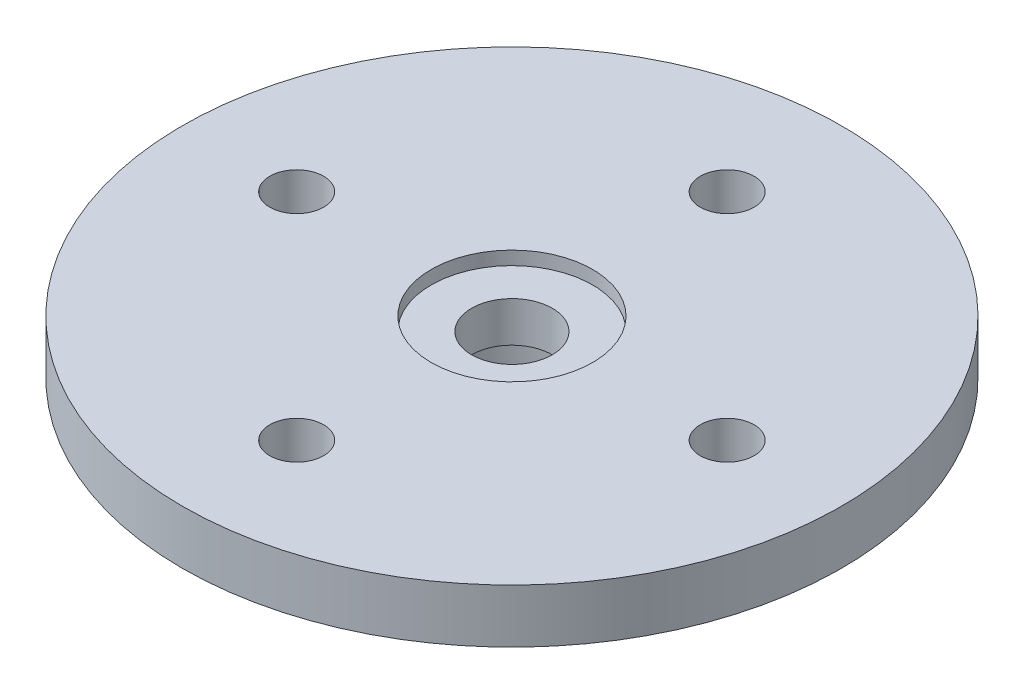
ISO-10303-21;
HEADER;
FILE_DESCRIPTION(('STEP AP214'),'2;1');
FILE_NAME('part.step','',(''),(''),'','','');
FILE_SCHEMA(('AUTOMOTIVE_DESIGN { 1 0 10303 214 1 1 1 1 }'));
ENDSEC;
DATA;
#1=APPLICATION_CONTEXT('core data for automotive mechanical design processes');
#2=APPLICATION_PROTOCOL_DEFINITION('international standard','automotive_design',2000,#1);
#3=PRODUCT_CONTEXT('',#1,'mechanical');
#4=PRODUCT('Part','Part','',(#3));
#5=PRODUCT_RELATED_PRODUCT_CATEGORY('part','',(#4));
#6=PRODUCT_DEFINITION_FORMATION('','',#4);
#7=PRODUCT_DEFINITION_CONTEXT('part definition',#1,'design');
#8=PRODUCT_DEFINITION('design','',#6,#7);
#9=PRODUCT_DEFINITION_SHAPE('','',#8);
#10=(LENGTH_UNIT() NAMED_UNIT(*) SI_UNIT(.MILLI.,.METRE.));
#11=(NAMED_UNIT(*) PLANE_ANGLE_UNIT() SI_UNIT($,.RADIAN.));
#12=(NAMED_UNIT(*) SI_UNIT($,.STERADIAN.) SOLID_ANGLE_UNIT());
#13=UNCERTAINTY_MEASURE_WITH_UNIT(LENGTH_MEASURE(1.E-05),#10,'distance_accuracy_value','');
#14=(GEOMETRIC_REPRESENTATION_CONTEXT(3) GLOBAL_UNCERTAINTY_ASSIGNED_CONTEXT((#13)) GLOBAL_UNIT_ASSIGNED_CONTEXT((#10,
#11,#12)) REPRESENTATION_CONTEXT('',''));
#15=CARTESIAN_POINT('',(0.,0.,0.));
#16=DIRECTION('',(0.,0.,1.));
#17=DIRECTION('',(1.,0.,0.));
#18=AXIS2_PLACEMENT_3D('',#15,#16,#17);
#19=CARTESIAN_POINT('',(0.,2.,0.));
#20=DIRECTION('',(0.,-1.,0.));
#21=DIRECTION('',(0.,0.,-1.));
#22=AXIS2_PLACEMENT_3D('',#19,#20,#21);
#23=CYLINDRICAL_SURFACE('',#22,1.5);
#24=CARTESIAN_POINT('',(0.,0.,0.));
#25=DIRECTION('',(0.,1.,0.));
#26=DIRECTION('',(0.,0.,1.));
#27=AXIS2_PLACEMENT_3D('',#24,#25,#26);
#28=CIRCLE('',#27,1.5);
#29=CARTESIAN_POINT('',(0.,0.,1.5));
#30=VERTEX_POINT('',#29);
#31=EDGE_CURVE('E52',#30,#30,#28,.T.);
#32=ORIENTED_EDGE('',*,*,#31,.F.);
#33=EDGE_LOOP('',(#32));
#34=FACE_BOUND('',#33,.T.);
#35=CARTESIAN_POINT('',(0.,1.5,0.));
#36=DIRECTION('',(0.,1.,0.));
#37=DIRECTION('',(0.,0.,1.));
#38=AXIS2_PLACEMENT_3D('',#35,#36,#37);
#39=CIRCLE('',#38,1.5);
#40=CARTESIAN_POINT('',(0.,1.5,1.5));
#41=VERTEX_POINT('',#40);
#42=EDGE_CURVE('E41',#41,#41,#39,.T.);
#43=ORIENTED_EDGE('',*,*,#42,.T.);
#44=EDGE_LOOP('',(#43));
#45=FACE_BOUND('',#44,.T.);
#46=ADVANCED_FACE('F37',(#34,#45),#23,.F.);
#47=CARTESIAN_POINT('',(0.,0.,0.));
#48=DIRECTION('',(0.,1.,0.));
#49=DIRECTION('',(0.,0.,1.));
#50=AXIS2_PLACEMENT_3D('',#47,#48,#49);
#51=PLANE('',#50);
#52=ORIENTED_EDGE('',*,*,#31,.T.);
#53=EDGE_LOOP('',(#52));
#54=FACE_BOUND('',#53,.T.);
#55=CARTESIAN_POINT('',(0.,0.,0.));
#56=DIRECTION('',(0.,-1.,0.));
#57=DIRECTION('',(0.,0.,-1.));
#58=AXIS2_PLACEMENT_3D('',#55,#56,#57);
#59=CIRCLE('',#58,2.9);
#60=CARTESIAN_POINT('',(0.,0.,-2.9));
#61=VERTEX_POINT('',#60);
#62=EDGE_CURVE('E85',#61,#61,#59,.T.);
#63=ORIENTED_EDGE('',*,*,#62,.T.);
#64=EDGE_LOOP('',(#63));
#65=FACE_BOUND('',#64,.T.);
#66=ADVANCED_FACE('F112',(#54,#65),#51,.F.);
#67=CARTESIAN_POINT('',(0.,2.,0.));
#68=DIRECTION('',(0.,-1.,0.));
#69=DIRECTION('',(0.,0.,-1.));
#70=AXIS2_PLACEMENT_3D('',#67,#68,#69);
#71=CYLINDRICAL_SURFACE('',#70,12.25);
#72=CARTESIAN_POINT('',(0.,2.,0.));
#73=DIRECTION('',(0.,1.,0.));
#74=DIRECTION('',(0.,0.,1.));
#75=AXIS2_PLACEMENT_3D('',#72,#73,#74);
#76=CIRCLE('',#75,12.25);
#77=CARTESIAN_POINT('',(0.,2.,12.25));
#78=VERTEX_POINT('',#77);
#79=EDGE_CURVE('E45',#78,#78,#76,.T.);
#80=ORIENTED_EDGE('',*,*,#79,.F.);
#81=EDGE_LOOP('',(#80));
#82=FACE_BOUND('',#81,.T.);
#83=CARTESIAN_POINT('',(0.,0.,0.));
#84=DIRECTION('',(0.,1.,0.));
#85=DIRECTION('',(0.,0.,1.));
#86=AXIS2_PLACEMENT_3D('',#83,#84,#85);
#87=CIRCLE('',#86,12.25);
#88=CARTESIAN_POINT('',(0.,0.,12.25));
#89=VERTEX_POINT('',#88);
#90=EDGE_CURVE('E56',#89,#89,#87,.T.);
#91=ORIENTED_EDGE('',*,*,#90,.T.);
#92=EDGE_LOOP('',(#91));
#93=FACE_BOUND('',#92,.T.);
#94=ADVANCED_FACE('F118',(#82,#93),#71,.T.);
#95=CARTESIAN_POINT('',(0.,2.,-8.));
#96=DIRECTION('',(0.,-1.,0.));
#97=DIRECTION('',(0.,0.,-1.));
#98=AXIS2_PLACEMENT_3D('',#95,#96,#97);
#99=CYLINDRICAL_SURFACE('',#98,1.);
#100=CARTESIAN_POINT('',(0.,2.,-8.));
#101=DIRECTION('',(0.,1.,0.));
#102=DIRECTION('',(0.,0.,1.));
#103=AXIS2_PLACEMENT_3D('',#100,#101,#102);
#104=CIRCLE('',#103,1.);
#105=CARTESIAN_POINT('',(0.,2.,-7.));
#106=VERTEX_POINT('',#105);
#107=EDGE_CURVE('E49',#106,#106,#104,.T.);
#108=ORIENTED_EDGE('',*,*,#107,.T.);
#109=EDGE_LOOP('',(#108));
#110=FACE_BOUND('',#109,.T.);
#111=CARTESIAN_POINT('',(0.,0.,-8.));
#112=DIRECTION('',(0.,1.,0.));
#113=DIRECTION('',(0.,0.,1.));
#114=AXIS2_PLACEMENT_3D('',#111,#112,#113);
#115=CIRCLE('',#114,1.);
#116=CARTESIAN_POINT('',(0.,0.,-7.));
#117=VERTEX_POINT('',#116);
#118=EDGE_CURVE('E59',#117,#117,#115,.T.);
#119=ORIENTED_EDGE('',*,*,#118,.F.);
#120=EDGE_LOOP('',(#119));
#121=FACE_BOUND('',#120,.T.);
#122=ADVANCED_FACE('F127',(#110,#121),#99,.F.);
#123=CARTESIAN_POINT('',(8.00000000000023,2.,-2.26393958003914E-13));
#124=DIRECTION('',(0.,-1.,0.));
#125=DIRECTION('',(0.,0.,-1.));
#126=AXIS2_PLACEMENT_3D('',#123,#124,#125);
#127=CYLINDRICAL_SURFACE('',#126,1.00000000000018);
#128=CARTESIAN_POINT('',(8.00000000000023,2.,-2.26393958003914E-13));
#129=DIRECTION('',(0.,1.,0.));
#130=DIRECTION('',(0.,0.,1.));
#131=AXIS2_PLACEMENT_3D('',#128,#129,#130);
#132=CIRCLE('',#131,1.00000000000018);
#133=CARTESIAN_POINT('',(8.00000000000023,2.,0.999999999999951));
#134=VERTEX_POINT('',#133);
#135=EDGE_CURVE('E74',#134,#134,#132,.T.);
#136=ORIENTED_EDGE('',*,*,#135,.T.);
#137=EDGE_LOOP('',(#136));
#138=FACE_BOUND('',#137,.T.);
#139=CARTESIAN_POINT('',(8.00000000000023,0.,-2.26393958003914E-13));
#140=DIRECTION('',(0.,1.,0.));
#141=DIRECTION('',(0.,0.,1.));
#142=AXIS2_PLACEMENT_3D('',#139,#140,#141);
#143=CIRCLE('',#142,1.00000000000018);
#144=CARTESIAN_POINT('',(8.00000000000023,0.,0.999999999999951));
#145=VERTEX_POINT('',#144);
#146=EDGE_CURVE('E62',#145,#145,#143,.T.);
#147=ORIENTED_EDGE('',*,*,#146,.F.);
#148=EDGE_LOOP('',(#147));
#149=FACE_BOUND('',#148,.T.);
#150=ADVANCED_FACE('F131',(#138,#149),#127,.F.);
#151=CARTESIAN_POINT('',(4.52787916007828E-13,2.,8.));
#152=DIRECTION('',(0.,-1.,0.));
#153=DIRECTION('',(0.,0.,-1.));
#154=AXIS2_PLACEMENT_3D('',#151,#152,#153);
#155=CYLINDRICAL_SURFACE('',#154,1.00000000000049);
#156=CARTESIAN_POINT('',(4.52787916007828E-13,2.,8.));
#157=DIRECTION('',(0.,1.,0.));
#158=DIRECTION('',(0.,0.,1.));
#159=AXIS2_PLACEMENT_3D('',#156,#157,#158);
#160=CIRCLE('',#159,1.00000000000049);
#161=CARTESIAN_POINT('',(4.52787916007828E-13,2.,9.00000000000049));
#162=VERTEX_POINT('',#161);
#163=EDGE_CURVE('E77',#162,#162,#160,.T.);
#164=ORIENTED_EDGE('',*,*,#163,.T.);
#165=EDGE_LOOP('',(#164));
#166=FACE_BOUND('',#165,.T.);
#167=CARTESIAN_POINT('',(4.52787916007828E-13,0.,8.));
#168=DIRECTION('',(0.,1.,0.));
#169=DIRECTION('',(0.,0.,1.));
#170=AXIS2_PLACEMENT_3D('',#167,#168,#169);
#171=CIRCLE('',#170,1.00000000000049);
#172=CARTESIAN_POINT('',(4.52787916007828E-13,0.,9.00000000000049));
#173=VERTEX_POINT('',#172);
#174=EDGE_CURVE('E65',#173,#173,#171,.T.);
#175=ORIENTED_EDGE('',*,*,#174,.F.);
#176=EDGE_LOOP('',(#175));
#177=FACE_BOUND('',#176,.T.);
#178=ADVANCED_FACE('F134',(#166,#177),#155,.F.);
#179=CARTESIAN_POINT('',(-7.99999999999977,2.,2.27373675443232E-13));
#180=DIRECTION('',(0.,-1.,0.));
#181=DIRECTION('',(0.,0.,-1.));
#182=AXIS2_PLACEMENT_3D('',#179,#180,#181);
#183=CYLINDRICAL_SURFACE('',#182,1.00000000000036);
#184=CARTESIAN_POINT('',(-7.99999999999977,2.,2.27373675443232E-13));
#185=DIRECTION('',(0.,1.,0.));
#186=DIRECTION('',(0.,0.,1.));
#187=AXIS2_PLACEMENT_3D('',#184,#185,#186);
#188=CIRCLE('',#187,1.00000000000036);
#189=CARTESIAN_POINT('',(-7.99999999999977,2.,1.00000000000059));
#190=VERTEX_POINT('',#189);
#191=EDGE_CURVE('E55',#190,#190,#188,.T.);
#192=ORIENTED_EDGE('',*,*,#191,.T.);
#193=EDGE_LOOP('',(#192));
#194=FACE_BOUND('',#193,.T.);
#195=CARTESIAN_POINT('',(-7.99999999999977,0.,2.27373675443232E-13));
#196=DIRECTION('',(0.,1.,0.));
#197=DIRECTION('',(0.,0.,1.));
#198=AXIS2_PLACEMENT_3D('',#195,#196,#197);
#199=CIRCLE('',#198,1.00000000000036);
#200=CARTESIAN_POINT('',(-7.99999999999977,0.,1.00000000000059));
#201=VERTEX_POINT('',#200);
#202=EDGE_CURVE('E68',#201,#201,#199,.T.);
#203=ORIENTED_EDGE('',*,*,#202,.F.);
#204=EDGE_LOOP('',(#203));
#205=FACE_BOUND('',#204,.T.);
#206=ADVANCED_FACE('F39',(#194,#205),#183,.F.);
#207=CARTESIAN_POINT('',(0.,2.,0.));
#208=DIRECTION('',(0.,1.,0.));
#209=DIRECTION('',(0.,0.,1.));
#210=AXIS2_PLACEMENT_3D('',#207,#208,#209);
#211=PLANE('',#210);
#212=CARTESIAN_POINT('',(0.,2.,0.));
#213=DIRECTION('',(0.,1.,0.));
#214=DIRECTION('',(0.,0.,1.));
#215=AXIS2_PLACEMENT_3D('',#212,#213,#214);
#216=CIRCLE('',#215,3.);
#217=CARTESIAN_POINT('',(0.,2.,3.));
#218=VERTEX_POINT('',#217);
#219=EDGE_CURVE('E90',#218,#218,#216,.T.);
#220=ORIENTED_EDGE('',*,*,#219,.F.);
#221=EDGE_LOOP('',(#220));
#222=FACE_BOUND('',#221,.T.);
#223=ORIENTED_EDGE('',*,*,#191,.F.);
#224=EDGE_LOOP('',(#223));
#225=FACE_BOUND('',#224,.T.);
#226=ORIENTED_EDGE('',*,*,#163,.F.);
#227=EDGE_LOOP('',(#226));
#228=FACE_BOUND('',#227,.T.);
#229=ORIENTED_EDGE('',*,*,#135,.F.);
#230=EDGE_LOOP('',(#229));
#231=FACE_BOUND('',#230,.T.);
#232=ORIENTED_EDGE('',*,*,#107,.F.);
#233=EDGE_LOOP('',(#232));
#234=FACE_BOUND('',#233,.T.);
#235=ORIENTED_EDGE('',*,*,#79,.T.);
#236=EDGE_LOOP('',(#235));
#237=FACE_BOUND('',#236,.T.);
#238=ADVANCED_FACE('F141',(#222,#225,#228,#231,#234,#237),#211,.T.);
#239=CARTESIAN_POINT('',(0.,0.,0.));
#240=DIRECTION('',(0.,1.,0.));
#241=DIRECTION('',(0.,0.,1.));
#242=AXIS2_PLACEMENT_3D('',#239,#240,#241);
#243=CIRCLE('',#242,4.9);
#244=CARTESIAN_POINT('',(0.,0.,4.9));
#245=VERTEX_POINT('',#244);
#246=EDGE_CURVE('E10',#245,#245,#243,.F.);
#247=ORIENTED_EDGE('',*,*,#246,.F.);
#248=EDGE_LOOP('',(#247));
#249=FACE_BOUND('',#248,.T.);
#250=ORIENTED_EDGE('',*,*,#202,.T.);
#251=EDGE_LOOP('',(#250));
#252=FACE_BOUND('',#251,.T.);
#253=ORIENTED_EDGE('',*,*,#174,.T.);
#254=EDGE_LOOP('',(#253));
#255=FACE_BOUND('',#254,.T.);
#256=ORIENTED_EDGE('',*,*,#146,.T.);
#257=EDGE_LOOP('',(#256));
#258=FACE_BOUND('',#257,.T.);
#259=ORIENTED_EDGE('',*,*,#118,.T.);
#260=EDGE_LOOP('',(#259));
#261=FACE_BOUND('',#260,.T.);
#262=ORIENTED_EDGE('',*,*,#90,.F.);
#263=EDGE_LOOP('',(#262));
#264=FACE_BOUND('',#263,.T.);
#265=ADVANCED_FACE('F121',(#249,#252,#255,#258,#261,#264),#51,.F.);
#266=CARTESIAN_POINT('',(0.,-3.,0.));
#267=DIRECTION('',(0.,-1.,0.));
#268=DIRECTION('',(0.,0.,-1.));
#269=AXIS2_PLACEMENT_3D('',#266,#267,#268);
#270=PLANE('',#269);
#271=CARTESIAN_POINT('',(0.,-3.,0.));
#272=DIRECTION('',(0.,-1.,0.));
#273=DIRECTION('',(0.,0.,-1.));
#274=AXIS2_PLACEMENT_3D('',#271,#272,#273);
#275=CIRCLE('',#274,4.9);
#276=CARTESIAN_POINT('',(0.,-3.,-4.9));
#277=VERTEX_POINT('',#276);
#278=EDGE_CURVE('E70',#277,#277,#275,.T.);
#279=ORIENTED_EDGE('',*,*,#278,.T.);
#280=EDGE_LOOP('',(#279));
#281=FACE_BOUND('',#280,.T.);
#282=CARTESIAN_POINT('',(0.,-3.,0.));
#283=DIRECTION('',(0.,-1.,0.));
#284=DIRECTION('',(0.,0.,-1.));
#285=AXIS2_PLACEMENT_3D('',#282,#283,#284);
#286=CIRCLE('',#285,2.9);
#287=CARTESIAN_POINT('',(0.,-3.,-2.9));
#288=VERTEX_POINT('',#287);
#289=EDGE_CURVE('E84',#288,#288,#286,.T.);
#290=ORIENTED_EDGE('',*,*,#289,.F.);
#291=EDGE_LOOP('',(#290));
#292=FACE_BOUND('',#291,.T.);
#293=ADVANCED_FACE('F149',(#281,#292),#270,.T.);
#294=CARTESIAN_POINT('',(0.,-3.,0.));
#295=DIRECTION('',(0.,1.,0.));
#296=DIRECTION('',(0.,0.,1.));
#297=AXIS2_PLACEMENT_3D('',#294,#295,#296);
#298=CYLINDRICAL_SURFACE('',#297,4.9);
#299=ORIENTED_EDGE('',*,*,#278,.F.);
#300=EDGE_LOOP('',(#299));
#301=FACE_BOUND('',#300,.T.);
#302=ORIENTED_EDGE('',*,*,#246,.T.);
#303=EDGE_LOOP('',(#302));
#304=FACE_BOUND('',#303,.T.);
#305=ADVANCED_FACE('F163',(#301,#304),#298,.T.);
#306=CARTESIAN_POINT('',(0.,-3.,0.));
#307=DIRECTION('',(0.,1.,0.));
#308=DIRECTION('',(0.,0.,1.));
#309=AXIS2_PLACEMENT_3D('',#306,#307,#308);
#310=CYLINDRICAL_SURFACE('',#309,2.9);
#311=ORIENTED_EDGE('',*,*,#289,.T.);
#312=EDGE_LOOP('',(#311));
#313=FACE_BOUND('',#312,.T.);
#314=ORIENTED_EDGE('',*,*,#62,.F.);
#315=EDGE_LOOP('',(#314));
#316=FACE_BOUND('',#315,.T.);
#317=ADVANCED_FACE('F108',(#313,#316),#310,.F.);
#318=CARTESIAN_POINT('',(0.,1.5,0.));
#319=DIRECTION('',(0.,1.,0.));
#320=DIRECTION('',(0.,0.,1.));
#321=AXIS2_PLACEMENT_3D('',#318,#319,#320);
#322=CYLINDRICAL_SURFACE('',#321,3.);
#323=CARTESIAN_POINT('',(0.,1.5,0.));
#324=DIRECTION('',(0.,1.,0.));
#325=DIRECTION('',(0.,0.,1.));
#326=AXIS2_PLACEMENT_3D('',#323,#324,#325);
#327=CIRCLE('',#326,3.);
#328=CARTESIAN_POINT('',(0.,1.5,3.));
#329=VERTEX_POINT('',#328);
#330=EDGE_CURVE('E93',#329,#329,#327,.T.);
#331=ORIENTED_EDGE('',*,*,#330,.F.);
#332=EDGE_LOOP('',(#331));
#333=FACE_BOUND('',#332,.T.);
#334=ORIENTED_EDGE('',*,*,#219,.T.);
#335=EDGE_LOOP('',(#334));
#336=FACE_BOUND('',#335,.T.);
#337=ADVANCED_FACE('F103',(#333,#336),#322,.F.);
#338=CARTESIAN_POINT('',(0.,1.5,0.));
#339=DIRECTION('',(0.,1.,0.));
#340=DIRECTION('',(0.,0.,1.));
#341=AXIS2_PLACEMENT_3D('',#338,#339,#340);
#342=PLANE('',#341);
#343=ORIENTED_EDGE('',*,*,#42,.F.);
#344=EDGE_LOOP('',(#343));
#345=FACE_BOUND('',#344,.T.);
#346=ORIENTED_EDGE('',*,*,#330,.T.);
#347=EDGE_LOOP('',(#346));
#348=FACE_BOUND('',#347,.T.);
#349=ADVANCED_FACE('F101',(#345,#348),#342,.T.);
#350=CLOSED_SHELL('',(#46,#66,#94,#122,#150,#178,#206,#238,#265,#293,#305,#317,#337,#349));
#351=MANIFOLD_SOLID_BREP('B2',#350);
#352=ADVANCED_BREP_SHAPE_REPRESENTATION('',(#18,#351),#14);
#353=SHAPE_DEFINITION_REPRESENTATION(#9,#352);
ENDSEC;
END-ISO-10303-21;
